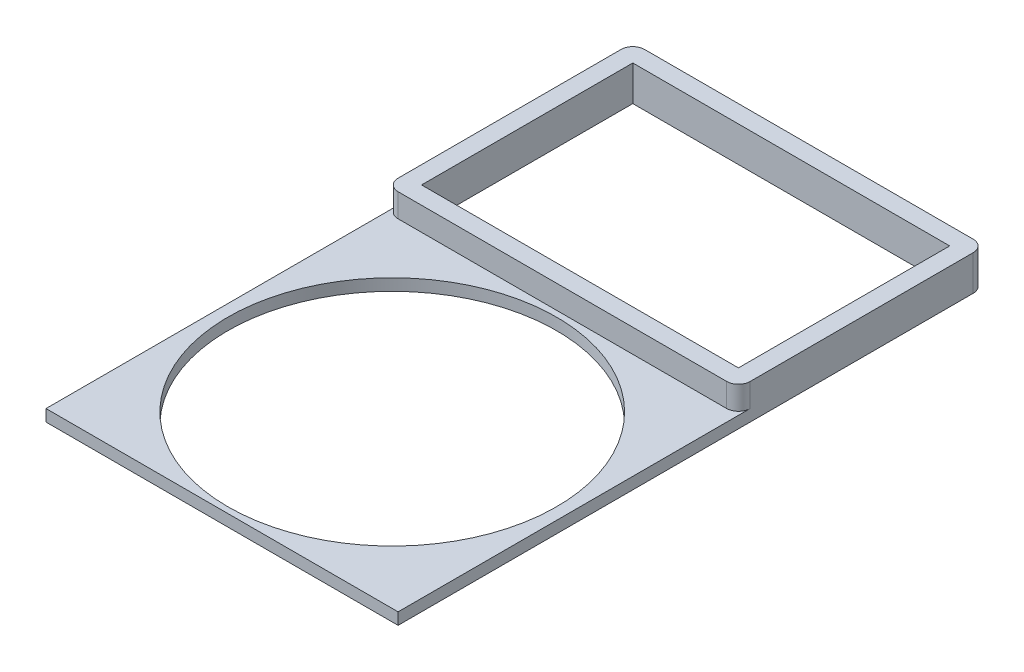
ISO-10303-21;
HEADER;
FILE_DESCRIPTION(('STEP AP214'),'2;1');
FILE_NAME('part.step','',(''),(''),'','','');
FILE_SCHEMA(('AUTOMOTIVE_DESIGN { 1 0 10303 214 1 1 1 1 }'));
ENDSEC;
DATA;
#1=APPLICATION_CONTEXT('core data for automotive mechanical design processes');
#2=APPLICATION_PROTOCOL_DEFINITION('international standard','automotive_design',2000,#1);
#3=PRODUCT_CONTEXT('',#1,'mechanical');
#4=PRODUCT('Part','Part','',(#3));
#5=PRODUCT_RELATED_PRODUCT_CATEGORY('part','',(#4));
#6=PRODUCT_DEFINITION_FORMATION('','',#4);
#7=PRODUCT_DEFINITION_CONTEXT('part definition',#1,'design');
#8=PRODUCT_DEFINITION('design','',#6,#7);
#9=PRODUCT_DEFINITION_SHAPE('','',#8);
#10=(LENGTH_UNIT() NAMED_UNIT(*) SI_UNIT(.MILLI.,.METRE.));
#11=(NAMED_UNIT(*) PLANE_ANGLE_UNIT() SI_UNIT($,.RADIAN.));
#12=(NAMED_UNIT(*) SI_UNIT($,.STERADIAN.) SOLID_ANGLE_UNIT());
#13=UNCERTAINTY_MEASURE_WITH_UNIT(LENGTH_MEASURE(1.E-05),#10,'distance_accuracy_value','');
#14=(GEOMETRIC_REPRESENTATION_CONTEXT(3) GLOBAL_UNCERTAINTY_ASSIGNED_CONTEXT((#13)) GLOBAL_UNIT_ASSIGNED_CONTEXT((#10,
#11,#12)) REPRESENTATION_CONTEXT('',''));
#15=CARTESIAN_POINT('',(0.,0.,0.));
#16=DIRECTION('',(0.,0.,1.));
#17=DIRECTION('',(1.,0.,0.));
#18=AXIS2_PLACEMENT_3D('',#15,#16,#17);
#19=CARTESIAN_POINT('',(0.,1.,0.));
#20=DIRECTION('',(0.,1.,0.));
#21=DIRECTION('',(0.,0.,1.));
#22=AXIS2_PLACEMENT_3D('',#19,#20,#21);
#23=PLANE('',#22);
#24=DIRECTION('',(1.,0.,0.));
#25=VECTOR('',#24,1.);
#26=CARTESIAN_POINT('',(-15.,1.,-4.));
#27=LINE('',#26,#25);
#28=CARTESIAN_POINT('',(-14.,1.,-4.));
#29=VERTEX_POINT('',#28);
#30=CARTESIAN_POINT('',(14.,1.,-4.));
#31=VERTEX_POINT('',#30);
#32=EDGE_CURVE('E160',#29,#31,#27,.T.);
#33=ORIENTED_EDGE('',*,*,#32,.F.);
#34=CARTESIAN_POINT('',(-14.,1.,-5.));
#35=DIRECTION('',(0.,1.,0.));
#36=DIRECTION('',(0.,0.,1.));
#37=AXIS2_PLACEMENT_3D('',#34,#35,#36);
#38=CIRCLE('',#37,1.);
#39=CARTESIAN_POINT('',(-15.,1.,-5.));
#40=VERTEX_POINT('',#39);
#41=EDGE_CURVE('E40',#29,#40,#38,.F.);
#42=ORIENTED_EDGE('',*,*,#41,.T.);
#43=DIRECTION('',(0.,0.,1.));
#44=VECTOR('',#43,1.);
#45=CARTESIAN_POINT('',(-15.,1.,25.));
#46=LINE('',#45,#44);
#47=CARTESIAN_POINT('',(-15.,1.,25.));
#48=VERTEX_POINT('',#47);
#49=EDGE_CURVE('E195',#40,#48,#46,.T.);
#50=ORIENTED_EDGE('',*,*,#49,.T.);
#51=DIRECTION('',(1.,0.,0.));
#52=VECTOR('',#51,1.);
#53=CARTESIAN_POINT('',(15.,1.,25.));
#54=LINE('',#53,#52);
#55=CARTESIAN_POINT('',(15.,1.,25.));
#56=VERTEX_POINT('',#55);
#57=EDGE_CURVE('E252',#48,#56,#54,.T.);
#58=ORIENTED_EDGE('',*,*,#57,.T.);
#59=DIRECTION('',(0.,0.,-1.));
#60=VECTOR('',#59,1.);
#61=CARTESIAN_POINT('',(15.,1.,25.));
#62=LINE('',#61,#60);
#63=CARTESIAN_POINT('',(15.,1.,-5.));
#64=VERTEX_POINT('',#63);
#65=EDGE_CURVE('E46',#56,#64,#62,.T.);
#66=ORIENTED_EDGE('',*,*,#65,.T.);
#67=CARTESIAN_POINT('',(14.,1.,-5.));
#68=DIRECTION('',(0.,1.,0.));
#69=DIRECTION('',(0.,0.,1.));
#70=AXIS2_PLACEMENT_3D('',#67,#68,#69);
#71=CIRCLE('',#70,1.);
#72=EDGE_CURVE('E11',#64,#31,#71,.F.);
#73=ORIENTED_EDGE('',*,*,#72,.T.);
#74=EDGE_LOOP('',(#33,#42,#50,#58,#66,#73));
#75=FACE_BOUND('',#74,.T.);
#76=CARTESIAN_POINT('',(0.,1.,10.5));
#77=DIRECTION('',(0.,1.,0.));
#78=DIRECTION('',(0.,0.,1.));
#79=AXIS2_PLACEMENT_3D('',#76,#77,#78);
#80=CIRCLE('',#79,14.);
#81=CARTESIAN_POINT('',(0.,1.,24.5));
#82=VERTEX_POINT('',#81);
#83=EDGE_CURVE('E176',#82,#82,#80,.T.);
#84=ORIENTED_EDGE('',*,*,#83,.F.);
#85=EDGE_LOOP('',(#84));
#86=FACE_BOUND('',#85,.T.);
#87=ADVANCED_FACE('F32',(#75,#86),#23,.T.);
#88=CARTESIAN_POINT('',(0.,0.,0.));
#89=DIRECTION('',(0.,1.,0.));
#90=DIRECTION('',(0.,0.,1.));
#91=AXIS2_PLACEMENT_3D('',#88,#89,#90);
#92=PLANE('',#91);
#93=DIRECTION('',(0.,0.,-1.));
#94=VECTOR('',#93,1.);
#95=CARTESIAN_POINT('',(13.5,0.,-5.5));
#96=LINE('',#95,#94);
#97=CARTESIAN_POINT('',(13.5,0.,-5.5));
#98=VERTEX_POINT('',#97);
#99=CARTESIAN_POINT('',(13.5,0.,-23.5));
#100=VERTEX_POINT('',#99);
#101=EDGE_CURVE('E452',#98,#100,#96,.T.);
#102=ORIENTED_EDGE('',*,*,#101,.T.);
#103=DIRECTION('',(-1.,0.,0.));
#104=VECTOR('',#103,1.);
#105=CARTESIAN_POINT('',(-13.5,0.,-23.5));
#106=LINE('',#105,#104);
#107=CARTESIAN_POINT('',(-13.5,0.,-23.5));
#108=VERTEX_POINT('',#107);
#109=EDGE_CURVE('E456',#100,#108,#106,.T.);
#110=ORIENTED_EDGE('',*,*,#109,.T.);
#111=DIRECTION('',(0.,0.,1.));
#112=VECTOR('',#111,1.);
#113=CARTESIAN_POINT('',(-13.5,0.,-5.5));
#114=LINE('',#113,#112);
#115=CARTESIAN_POINT('',(-13.5,0.,-5.5));
#116=VERTEX_POINT('',#115);
#117=EDGE_CURVE('E459',#108,#116,#114,.T.);
#118=ORIENTED_EDGE('',*,*,#117,.T.);
#119=DIRECTION('',(1.,0.,0.));
#120=VECTOR('',#119,1.);
#121=CARTESIAN_POINT('',(-13.5,0.,-5.5));
#122=LINE('',#121,#120);
#123=EDGE_CURVE('E138',#116,#98,#122,.T.);
#124=ORIENTED_EDGE('',*,*,#123,.T.);
#125=EDGE_LOOP('',(#102,#110,#118,#124));
#126=FACE_BOUND('',#125,.T.);
#127=DIRECTION('',(0.,0.,1.));
#128=VECTOR('',#127,1.);
#129=CARTESIAN_POINT('',(-15.,0.,25.));
#130=LINE('',#129,#128);
#131=CARTESIAN_POINT('',(-15.,0.,-24.));
#132=VERTEX_POINT('',#131);
#133=CARTESIAN_POINT('',(-15.,0.,25.));
#134=VERTEX_POINT('',#133);
#135=EDGE_CURVE('E246',#132,#134,#130,.T.);
#136=ORIENTED_EDGE('',*,*,#135,.F.);
#137=CARTESIAN_POINT('',(-14.,0.,-24.));
#138=DIRECTION('',(0.,1.,0.));
#139=DIRECTION('',(0.,0.,1.));
#140=AXIS2_PLACEMENT_3D('',#137,#138,#139);
#141=CIRCLE('',#140,1.);
#142=CARTESIAN_POINT('',(-14.,0.,-25.));
#143=VERTEX_POINT('',#142);
#144=EDGE_CURVE('E219',#132,#143,#141,.F.);
#145=ORIENTED_EDGE('',*,*,#144,.T.);
#146=DIRECTION('',(-1.,0.,0.));
#147=VECTOR('',#146,1.);
#148=CARTESIAN_POINT('',(15.,0.,-25.));
#149=LINE('',#148,#147);
#150=CARTESIAN_POINT('',(14.,0.,-25.));
#151=VERTEX_POINT('',#150);
#152=EDGE_CURVE('E244',#151,#143,#149,.T.);
#153=ORIENTED_EDGE('',*,*,#152,.F.);
#154=CARTESIAN_POINT('',(14.,0.,-24.));
#155=DIRECTION('',(0.,1.,0.));
#156=DIRECTION('',(0.,0.,1.));
#157=AXIS2_PLACEMENT_3D('',#154,#155,#156);
#158=CIRCLE('',#157,1.);
#159=CARTESIAN_POINT('',(15.,0.,-24.));
#160=VERTEX_POINT('',#159);
#161=EDGE_CURVE('E209',#151,#160,#158,.F.);
#162=ORIENTED_EDGE('',*,*,#161,.T.);
#163=DIRECTION('',(0.,0.,-1.));
#164=VECTOR('',#163,1.);
#165=CARTESIAN_POINT('',(15.,0.,25.));
#166=LINE('',#165,#164);
#167=CARTESIAN_POINT('',(15.,0.,25.));
#168=VERTEX_POINT('',#167);
#169=EDGE_CURVE('E250',#168,#160,#166,.T.);
#170=ORIENTED_EDGE('',*,*,#169,.F.);
#171=DIRECTION('',(1.,0.,0.));
#172=VECTOR('',#171,1.);
#173=CARTESIAN_POINT('',(15.,0.,25.));
#174=LINE('',#173,#172);
#175=EDGE_CURVE('E254',#134,#168,#174,.T.);
#176=ORIENTED_EDGE('',*,*,#175,.F.);
#177=EDGE_LOOP('',(#136,#145,#153,#162,#170,#176));
#178=FACE_BOUND('',#177,.T.);
#179=CARTESIAN_POINT('',(0.,0.,10.5));
#180=DIRECTION('',(0.,1.,0.));
#181=DIRECTION('',(0.,0.,1.));
#182=AXIS2_PLACEMENT_3D('',#179,#180,#181);
#183=CIRCLE('',#182,14.);
#184=CARTESIAN_POINT('',(0.,0.,24.5));
#185=VERTEX_POINT('',#184);
#186=EDGE_CURVE('E173',#185,#185,#183,.T.);
#187=ORIENTED_EDGE('',*,*,#186,.T.);
#188=EDGE_LOOP('',(#187));
#189=FACE_BOUND('',#188,.T.);
#190=ADVANCED_FACE('F242',(#126,#178,#189),#92,.F.);
#191=CARTESIAN_POINT('',(-15.,1.,25.));
#192=DIRECTION('',(1.,0.,0.));
#193=DIRECTION('',(0.,0.,-1.));
#194=AXIS2_PLACEMENT_3D('',#191,#192,#193);
#195=PLANE('',#194);
#196=DIRECTION('',(0.,0.,1.));
#197=VECTOR('',#196,1.);
#198=CARTESIAN_POINT('',(-15.,3.,-25.));
#199=LINE('',#198,#197);
#200=CARTESIAN_POINT('',(-15.,3.,-24.));
#201=VERTEX_POINT('',#200);
#202=CARTESIAN_POINT('',(-15.,3.,-5.));
#203=VERTEX_POINT('',#202);
#204=EDGE_CURVE('E161',#201,#203,#199,.T.);
#205=ORIENTED_EDGE('',*,*,#204,.F.);
#206=DIRECTION('',(0.,-1.,0.));
#207=VECTOR('',#206,1.);
#208=CARTESIAN_POINT('',(-15.,1.,-24.));
#209=LINE('',#208,#207);
#210=EDGE_CURVE('E205',#201,#132,#209,.T.);
#211=ORIENTED_EDGE('',*,*,#210,.T.);
#212=ORIENTED_EDGE('',*,*,#135,.T.);
#213=DIRECTION('',(0.,-1.,0.));
#214=VECTOR('',#213,1.);
#215=CARTESIAN_POINT('',(-15.,1.,25.));
#216=LINE('',#215,#214);
#217=EDGE_CURVE('E206',#48,#134,#216,.T.);
#218=ORIENTED_EDGE('',*,*,#217,.F.);
#219=ORIENTED_EDGE('',*,*,#49,.F.);
#220=DIRECTION('',(0.,-1.,0.));
#221=VECTOR('',#220,1.);
#222=CARTESIAN_POINT('',(-15.,1.,-5.));
#223=LINE('',#222,#221);
#224=EDGE_CURVE('E200',#40,#203,#223,.F.);
#225=ORIENTED_EDGE('',*,*,#224,.T.);
#226=EDGE_LOOP('',(#205,#211,#212,#218,#219,#225));
#227=FACE_BOUND('',#226,.T.);
#228=ADVANCED_FACE('F236',(#227),#195,.F.);
#229=CARTESIAN_POINT('',(15.,1.,25.));
#230=DIRECTION('',(0.,0.,-1.));
#231=DIRECTION('',(-1.,0.,0.));
#232=AXIS2_PLACEMENT_3D('',#229,#230,#231);
#233=PLANE('',#232);
#234=ORIENTED_EDGE('',*,*,#175,.T.);
#235=DIRECTION('',(0.,-1.,0.));
#236=VECTOR('',#235,1.);
#237=CARTESIAN_POINT('',(15.,1.,25.));
#238=LINE('',#237,#236);
#239=EDGE_CURVE('E212',#56,#168,#238,.T.);
#240=ORIENTED_EDGE('',*,*,#239,.F.);
#241=ORIENTED_EDGE('',*,*,#57,.F.);
#242=ORIENTED_EDGE('',*,*,#217,.T.);
#243=EDGE_LOOP('',(#234,#240,#241,#242));
#244=FACE_BOUND('',#243,.T.);
#245=ADVANCED_FACE('F269',(#244),#233,.F.);
#246=CARTESIAN_POINT('',(15.,1.,25.));
#247=DIRECTION('',(-1.,0.,0.));
#248=DIRECTION('',(0.,0.,1.));
#249=AXIS2_PLACEMENT_3D('',#246,#247,#248);
#250=PLANE('',#249);
#251=ORIENTED_EDGE('',*,*,#169,.T.);
#252=DIRECTION('',(0.,-1.,0.));
#253=VECTOR('',#252,1.);
#254=CARTESIAN_POINT('',(15.,1.,-24.));
#255=LINE('',#254,#253);
#256=CARTESIAN_POINT('',(15.,3.,-24.));
#257=VERTEX_POINT('',#256);
#258=EDGE_CURVE('E191',#160,#257,#255,.F.);
#259=ORIENTED_EDGE('',*,*,#258,.T.);
#260=DIRECTION('',(0.,0.,-1.));
#261=VECTOR('',#260,1.);
#262=CARTESIAN_POINT('',(15.,3.,-25.));
#263=LINE('',#262,#261);
#264=CARTESIAN_POINT('',(15.,3.,-5.));
#265=VERTEX_POINT('',#264);
#266=EDGE_CURVE('E167',#265,#257,#263,.T.);
#267=ORIENTED_EDGE('',*,*,#266,.F.);
#268=DIRECTION('',(0.,-1.,0.));
#269=VECTOR('',#268,1.);
#270=CARTESIAN_POINT('',(15.,1.,-5.));
#271=LINE('',#270,#269);
#272=EDGE_CURVE('E188',#265,#64,#271,.T.);
#273=ORIENTED_EDGE('',*,*,#272,.T.);
#274=ORIENTED_EDGE('',*,*,#65,.F.);
#275=ORIENTED_EDGE('',*,*,#239,.T.);
#276=EDGE_LOOP('',(#251,#259,#267,#273,#274,#275));
#277=FACE_BOUND('',#276,.T.);
#278=ADVANCED_FACE('F273',(#277),#250,.F.);
#279=CARTESIAN_POINT('',(15.,1.,-25.));
#280=DIRECTION('',(0.,0.,1.));
#281=DIRECTION('',(1.,0.,0.));
#282=AXIS2_PLACEMENT_3D('',#279,#280,#281);
#283=PLANE('',#282);
#284=ORIENTED_EDGE('',*,*,#152,.T.);
#285=DIRECTION('',(0.,-1.,0.));
#286=VECTOR('',#285,1.);
#287=CARTESIAN_POINT('',(-14.,1.,-25.));
#288=LINE('',#287,#286);
#289=CARTESIAN_POINT('',(-14.,3.,-25.));
#290=VERTEX_POINT('',#289);
#291=EDGE_CURVE('E224',#143,#290,#288,.F.);
#292=ORIENTED_EDGE('',*,*,#291,.T.);
#293=DIRECTION('',(-1.,0.,0.));
#294=VECTOR('',#293,1.);
#295=CARTESIAN_POINT('',(-15.,3.,-25.));
#296=LINE('',#295,#294);
#297=CARTESIAN_POINT('',(14.,3.,-25.));
#298=VERTEX_POINT('',#297);
#299=EDGE_CURVE('E170',#298,#290,#296,.T.);
#300=ORIENTED_EDGE('',*,*,#299,.F.);
#301=DIRECTION('',(0.,-1.,0.));
#302=VECTOR('',#301,1.);
#303=CARTESIAN_POINT('',(14.,1.,-25.));
#304=LINE('',#303,#302);
#305=EDGE_CURVE('E221',#298,#151,#304,.T.);
#306=ORIENTED_EDGE('',*,*,#305,.T.);
#307=EDGE_LOOP('',(#284,#292,#300,#306));
#308=FACE_BOUND('',#307,.T.);
#309=ADVANCED_FACE('F248',(#308),#283,.F.);
#310=CARTESIAN_POINT('',(13.5,1.,-5.5));
#311=DIRECTION('',(-1.,0.,0.));
#312=DIRECTION('',(0.,0.,1.));
#313=AXIS2_PLACEMENT_3D('',#310,#311,#312);
#314=PLANE('',#313);
#315=ORIENTED_EDGE('',*,*,#101,.F.);
#316=DIRECTION('',(0.,-1.,0.));
#317=VECTOR('',#316,1.);
#318=CARTESIAN_POINT('',(13.5,1.,-5.5));
#319=LINE('',#318,#317);
#320=CARTESIAN_POINT('',(13.5,3.,-5.5));
#321=VERTEX_POINT('',#320);
#322=EDGE_CURVE('E143',#321,#98,#319,.T.);
#323=ORIENTED_EDGE('',*,*,#322,.F.);
#324=DIRECTION('',(0.,0.,-1.));
#325=VECTOR('',#324,1.);
#326=CARTESIAN_POINT('',(13.5,3.,-23.5));
#327=LINE('',#326,#325);
#328=CARTESIAN_POINT('',(13.5,3.,-23.5));
#329=VERTEX_POINT('',#328);
#330=EDGE_CURVE('E154',#321,#329,#327,.T.);
#331=ORIENTED_EDGE('',*,*,#330,.T.);
#332=DIRECTION('',(0.,-1.,0.));
#333=VECTOR('',#332,1.);
#334=CARTESIAN_POINT('',(13.5,1.,-23.5));
#335=LINE('',#334,#333);
#336=EDGE_CURVE('E263',#329,#100,#335,.T.);
#337=ORIENTED_EDGE('',*,*,#336,.T.);
#338=EDGE_LOOP('',(#315,#323,#331,#337));
#339=FACE_BOUND('',#338,.T.);
#340=ADVANCED_FACE('F303',(#339),#314,.T.);
#341=CARTESIAN_POINT('',(-13.5,1.,-23.5));
#342=DIRECTION('',(0.,0.,1.));
#343=DIRECTION('',(1.,0.,0.));
#344=AXIS2_PLACEMENT_3D('',#341,#342,#343);
#345=PLANE('',#344);
#346=ORIENTED_EDGE('',*,*,#109,.F.);
#347=ORIENTED_EDGE('',*,*,#336,.F.);
#348=DIRECTION('',(-1.,0.,0.));
#349=VECTOR('',#348,1.);
#350=CARTESIAN_POINT('',(-13.5,3.,-23.5));
#351=LINE('',#350,#349);
#352=CARTESIAN_POINT('',(-13.5,3.,-23.5));
#353=VERTEX_POINT('',#352);
#354=EDGE_CURVE('E156',#329,#353,#351,.T.);
#355=ORIENTED_EDGE('',*,*,#354,.T.);
#356=DIRECTION('',(0.,-1.,0.));
#357=VECTOR('',#356,1.);
#358=CARTESIAN_POINT('',(-13.5,1.,-23.5));
#359=LINE('',#358,#357);
#360=EDGE_CURVE('E142',#353,#108,#359,.T.);
#361=ORIENTED_EDGE('',*,*,#360,.T.);
#362=EDGE_LOOP('',(#346,#347,#355,#361));
#363=FACE_BOUND('',#362,.T.);
#364=ADVANCED_FACE('F400',(#363),#345,.T.);
#365=CARTESIAN_POINT('',(-13.5,1.,-5.5));
#366=DIRECTION('',(1.,0.,0.));
#367=DIRECTION('',(0.,0.,-1.));
#368=AXIS2_PLACEMENT_3D('',#365,#366,#367);
#369=PLANE('',#368);
#370=ORIENTED_EDGE('',*,*,#117,.F.);
#371=ORIENTED_EDGE('',*,*,#360,.F.);
#372=DIRECTION('',(0.,0.,1.));
#373=VECTOR('',#372,1.);
#374=CARTESIAN_POINT('',(-13.5,3.,-23.5));
#375=LINE('',#374,#373);
#376=CARTESIAN_POINT('',(-13.5,3.,-5.5));
#377=VERTEX_POINT('',#376);
#378=EDGE_CURVE('E146',#353,#377,#375,.T.);
#379=ORIENTED_EDGE('',*,*,#378,.T.);
#380=DIRECTION('',(0.,-1.,0.));
#381=VECTOR('',#380,1.);
#382=CARTESIAN_POINT('',(-13.5,1.,-5.5));
#383=LINE('',#382,#381);
#384=EDGE_CURVE('E130',#377,#116,#383,.T.);
#385=ORIENTED_EDGE('',*,*,#384,.T.);
#386=EDGE_LOOP('',(#370,#371,#379,#385));
#387=FACE_BOUND('',#386,.T.);
#388=ADVANCED_FACE('F147',(#387),#369,.T.);
#389=CARTESIAN_POINT('',(-13.5,1.,-5.5));
#390=DIRECTION('',(0.,0.,-1.));
#391=DIRECTION('',(-1.,0.,0.));
#392=AXIS2_PLACEMENT_3D('',#389,#390,#391);
#393=PLANE('',#392);
#394=ORIENTED_EDGE('',*,*,#123,.F.);
#395=ORIENTED_EDGE('',*,*,#384,.F.);
#396=DIRECTION('',(1.,0.,0.));
#397=VECTOR('',#396,1.);
#398=CARTESIAN_POINT('',(-13.5,3.,-5.5));
#399=LINE('',#398,#397);
#400=EDGE_CURVE('E135',#377,#321,#399,.T.);
#401=ORIENTED_EDGE('',*,*,#400,.T.);
#402=ORIENTED_EDGE('',*,*,#322,.T.);
#403=EDGE_LOOP('',(#394,#395,#401,#402));
#404=FACE_BOUND('',#403,.T.);
#405=ADVANCED_FACE('F132',(#404),#393,.T.);
#406=CARTESIAN_POINT('',(0.,1.,10.5));
#407=DIRECTION('',(0.,-1.,0.));
#408=DIRECTION('',(0.,0.,-1.));
#409=AXIS2_PLACEMENT_3D('',#406,#407,#408);
#410=CYLINDRICAL_SURFACE('',#409,14.);
#411=ORIENTED_EDGE('',*,*,#83,.T.);
#412=EDGE_LOOP('',(#411));
#413=FACE_BOUND('',#412,.T.);
#414=ORIENTED_EDGE('',*,*,#186,.F.);
#415=EDGE_LOOP('',(#414));
#416=FACE_BOUND('',#415,.T.);
#417=ADVANCED_FACE('F292',(#413,#416),#410,.F.);
#418=CARTESIAN_POINT('',(0.,3.,0.));
#419=DIRECTION('',(0.,1.,0.));
#420=DIRECTION('',(0.,0.,1.));
#421=AXIS2_PLACEMENT_3D('',#418,#419,#420);
#422=PLANE('',#421);
#423=ORIENTED_EDGE('',*,*,#299,.T.);
#424=CARTESIAN_POINT('',(-14.,3.,-24.));
#425=DIRECTION('',(0.,1.,0.));
#426=DIRECTION('',(0.,0.,1.));
#427=AXIS2_PLACEMENT_3D('',#424,#425,#426);
#428=CIRCLE('',#427,1.);
#429=EDGE_CURVE('E181',#290,#201,#428,.T.);
#430=ORIENTED_EDGE('',*,*,#429,.T.);
#431=ORIENTED_EDGE('',*,*,#204,.T.);
#432=CARTESIAN_POINT('',(-14.,3.,-5.));
#433=DIRECTION('',(0.,1.,0.));
#434=DIRECTION('',(0.,0.,1.));
#435=AXIS2_PLACEMENT_3D('',#432,#433,#434);
#436=CIRCLE('',#435,1.);
#437=CARTESIAN_POINT('',(-14.,3.,-4.));
#438=VERTEX_POINT('',#437);
#439=EDGE_CURVE('E202',#203,#438,#436,.T.);
#440=ORIENTED_EDGE('',*,*,#439,.T.);
#441=DIRECTION('',(1.,0.,0.));
#442=VECTOR('',#441,1.);
#443=CARTESIAN_POINT('',(-15.,3.,-4.));
#444=LINE('',#443,#442);
#445=CARTESIAN_POINT('',(14.,3.,-4.));
#446=VERTEX_POINT('',#445);
#447=EDGE_CURVE('E164',#438,#446,#444,.T.);
#448=ORIENTED_EDGE('',*,*,#447,.T.);
#449=CARTESIAN_POINT('',(14.,3.,-5.));
#450=DIRECTION('',(0.,1.,0.));
#451=DIRECTION('',(0.,0.,1.));
#452=AXIS2_PLACEMENT_3D('',#449,#450,#451);
#453=CIRCLE('',#452,1.);
#454=EDGE_CURVE('E226',#446,#265,#453,.T.);
#455=ORIENTED_EDGE('',*,*,#454,.T.);
#456=ORIENTED_EDGE('',*,*,#266,.T.);
#457=CARTESIAN_POINT('',(14.,3.,-24.));
#458=DIRECTION('',(0.,1.,0.));
#459=DIRECTION('',(0.,0.,1.));
#460=AXIS2_PLACEMENT_3D('',#457,#458,#459);
#461=CIRCLE('',#460,1.);
#462=EDGE_CURVE('E228',#257,#298,#461,.T.);
#463=ORIENTED_EDGE('',*,*,#462,.T.);
#464=EDGE_LOOP('',(#423,#430,#431,#440,#448,#455,#456,#463));
#465=FACE_BOUND('',#464,.T.);
#466=ORIENTED_EDGE('',*,*,#400,.F.);
#467=ORIENTED_EDGE('',*,*,#378,.F.);
#468=ORIENTED_EDGE('',*,*,#354,.F.);
#469=ORIENTED_EDGE('',*,*,#330,.F.);
#470=EDGE_LOOP('',(#466,#467,#468,#469));
#471=FACE_BOUND('',#470,.T.);
#472=ADVANCED_FACE('F152',(#465,#471),#422,.T.);
#473=CARTESIAN_POINT('',(-15.,3.,-4.));
#474=DIRECTION('',(0.,0.,-1.));
#475=DIRECTION('',(-1.,0.,0.));
#476=AXIS2_PLACEMENT_3D('',#473,#474,#475);
#477=PLANE('',#476);
#478=ORIENTED_EDGE('',*,*,#447,.F.);
#479=DIRECTION('',(0.,-1.,0.));
#480=VECTOR('',#479,1.);
#481=CARTESIAN_POINT('',(-14.,3.,-4.));
#482=LINE('',#481,#480);
#483=EDGE_CURVE('E185',#438,#29,#482,.T.);
#484=ORIENTED_EDGE('',*,*,#483,.T.);
#485=ORIENTED_EDGE('',*,*,#32,.T.);
#486=DIRECTION('',(0.,-1.,0.));
#487=VECTOR('',#486,1.);
#488=CARTESIAN_POINT('',(14.,3.,-4.));
#489=LINE('',#488,#487);
#490=EDGE_CURVE('E183',#31,#446,#489,.F.);
#491=ORIENTED_EDGE('',*,*,#490,.T.);
#492=EDGE_LOOP('',(#478,#484,#485,#491));
#493=FACE_BOUND('',#492,.T.);
#494=ADVANCED_FACE('F284',(#493),#477,.F.);
#495=CARTESIAN_POINT('',(-14.,1.,-24.));
#496=DIRECTION('',(0.,-1.,0.));
#497=DIRECTION('',(0.,0.,-1.));
#498=AXIS2_PLACEMENT_3D('',#495,#496,#497);
#499=CYLINDRICAL_SURFACE('',#498,1.);
#500=ORIENTED_EDGE('',*,*,#429,.F.);
#501=ORIENTED_EDGE('',*,*,#291,.F.);
#502=ORIENTED_EDGE('',*,*,#144,.F.);
#503=ORIENTED_EDGE('',*,*,#210,.F.);
#504=EDGE_LOOP('',(#500,#501,#502,#503));
#505=FACE_BOUND('',#504,.T.);
#506=ADVANCED_FACE('F238',(#505),#499,.T.);
#507=CARTESIAN_POINT('',(-14.,3.,-5.));
#508=DIRECTION('',(0.,-1.,0.));
#509=DIRECTION('',(0.,0.,-1.));
#510=AXIS2_PLACEMENT_3D('',#507,#508,#509);
#511=CYLINDRICAL_SURFACE('',#510,1.);
#512=ORIENTED_EDGE('',*,*,#439,.F.);
#513=ORIENTED_EDGE('',*,*,#224,.F.);
#514=ORIENTED_EDGE('',*,*,#41,.F.);
#515=ORIENTED_EDGE('',*,*,#483,.F.);
#516=EDGE_LOOP('',(#512,#513,#514,#515));
#517=FACE_BOUND('',#516,.T.);
#518=ADVANCED_FACE('F201',(#517),#511,.T.);
#519=CARTESIAN_POINT('',(14.,1.,-24.));
#520=DIRECTION('',(0.,-1.,0.));
#521=DIRECTION('',(0.,0.,-1.));
#522=AXIS2_PLACEMENT_3D('',#519,#520,#521);
#523=CYLINDRICAL_SURFACE('',#522,1.);
#524=ORIENTED_EDGE('',*,*,#462,.F.);
#525=ORIENTED_EDGE('',*,*,#258,.F.);
#526=ORIENTED_EDGE('',*,*,#161,.F.);
#527=ORIENTED_EDGE('',*,*,#305,.F.);
#528=EDGE_LOOP('',(#524,#525,#526,#527));
#529=FACE_BOUND('',#528,.T.);
#530=ADVANCED_FACE('F277',(#529),#523,.T.);
#531=CARTESIAN_POINT('',(14.,1.,-5.));
#532=DIRECTION('',(0.,-1.,0.));
#533=DIRECTION('',(0.,0.,-1.));
#534=AXIS2_PLACEMENT_3D('',#531,#532,#533);
#535=CYLINDRICAL_SURFACE('',#534,1.);
#536=ORIENTED_EDGE('',*,*,#454,.F.);
#537=ORIENTED_EDGE('',*,*,#490,.F.);
#538=ORIENTED_EDGE('',*,*,#72,.F.);
#539=ORIENTED_EDGE('',*,*,#272,.F.);
#540=EDGE_LOOP('',(#536,#537,#538,#539));
#541=FACE_BOUND('',#540,.T.);
#542=ADVANCED_FACE('F34',(#541),#535,.T.);
#543=CLOSED_SHELL('',(#87,#190,#228,#245,#278,#309,#340,#364,#388,#405,#417,#472,#494,#506,#518,
#530,#542));
#544=MANIFOLD_SOLID_BREP('B2',#543);
#545=ADVANCED_BREP_SHAPE_REPRESENTATION('',(#18,#544),#14);
#546=SHAPE_DEFINITION_REPRESENTATION(#9,#545);
ENDSEC;
END-ISO-10303-21;
